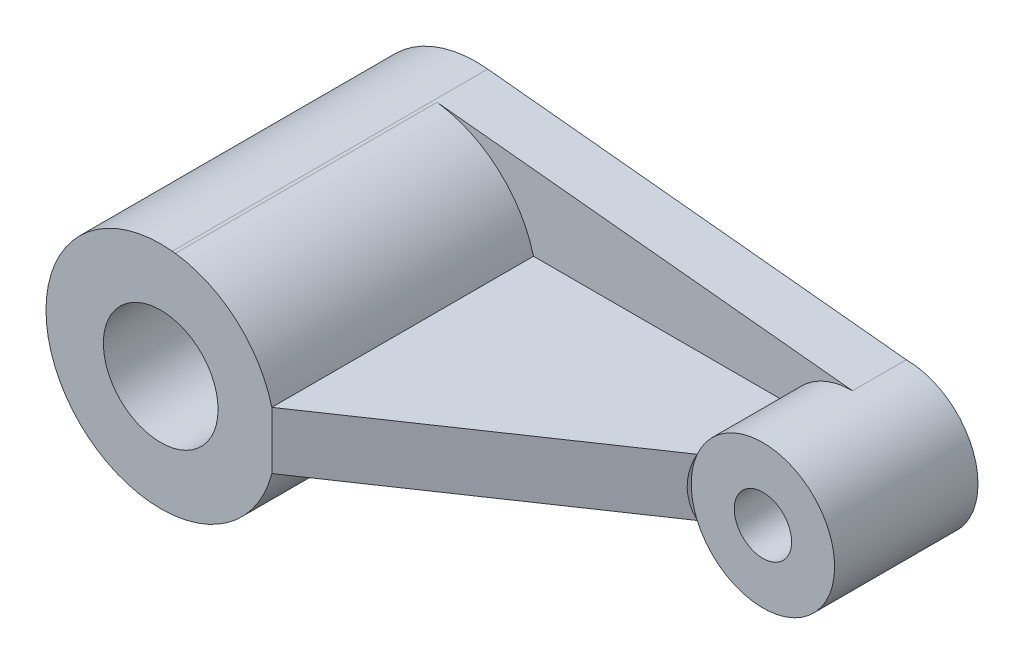
ISO-10303-21;
HEADER;
FILE_DESCRIPTION(('STEP AP214'),'2;1');
FILE_NAME('part.step','',(''),(''),'','','');
FILE_SCHEMA(('AUTOMOTIVE_DESIGN { 1 0 10303 214 1 1 1 1 }'));
ENDSEC;
DATA;
#1=APPLICATION_CONTEXT('core data for automotive mechanical design processes');
#2=APPLICATION_PROTOCOL_DEFINITION('international standard','automotive_design',2000,#1);
#3=PRODUCT_CONTEXT('',#1,'mechanical');
#4=PRODUCT('Part','Part','',(#3));
#5=PRODUCT_RELATED_PRODUCT_CATEGORY('part','',(#4));
#6=PRODUCT_DEFINITION_FORMATION('','',#4);
#7=PRODUCT_DEFINITION_CONTEXT('part definition',#1,'design');
#8=PRODUCT_DEFINITION('design','',#6,#7);
#9=PRODUCT_DEFINITION_SHAPE('','',#8);
#10=(LENGTH_UNIT() NAMED_UNIT(*) SI_UNIT(.MILLI.,.METRE.));
#11=(NAMED_UNIT(*) PLANE_ANGLE_UNIT() SI_UNIT($,.RADIAN.));
#12=(NAMED_UNIT(*) SI_UNIT($,.STERADIAN.) SOLID_ANGLE_UNIT());
#13=UNCERTAINTY_MEASURE_WITH_UNIT(LENGTH_MEASURE(1.E-05),#10,'distance_accuracy_value','');
#14=(GEOMETRIC_REPRESENTATION_CONTEXT(3) GLOBAL_UNCERTAINTY_ASSIGNED_CONTEXT((#13)) GLOBAL_UNIT_ASSIGNED_CONTEXT((#10,
#11,#12)) REPRESENTATION_CONTEXT('',''));
#15=CARTESIAN_POINT('',(0.,0.,0.));
#16=DIRECTION('',(0.,0.,1.));
#17=DIRECTION('',(1.,0.,0.));
#18=AXIS2_PLACEMENT_3D('',#15,#16,#17);
#19=CARTESIAN_POINT('',(0.,0.,15.));
#20=DIRECTION('',(0.,0.,1.));
#21=DIRECTION('',(1.,0.,0.));
#22=AXIS2_PLACEMENT_3D('',#19,#20,#21);
#23=PLANE('',#22);
#24=CARTESIAN_POINT('',(120.,0.,15.));
#25=DIRECTION('',(0.,0.,1.));
#26=DIRECTION('',(1.,0.,0.));
#27=AXIS2_PLACEMENT_3D('',#24,#25,#26);
#28=CIRCLE('',#27,20.);
#29=CARTESIAN_POINT('',(101.669697220177,-8.,15.));
#30=VERTEX_POINT('',#29);
#31=CARTESIAN_POINT('',(120.,-20.,15.));
#32=VERTEX_POINT('',#31);
#33=EDGE_CURVE('E65',#30,#32,#28,.T.);
#34=ORIENTED_EDGE('',*,*,#33,.F.);
#35=DIRECTION('',(1.,0.,0.));
#36=VECTOR('',#35,1.);
#37=CARTESIAN_POINT('',(0.,-8.,15.));
#38=LINE('',#37,#36);
#39=CARTESIAN_POINT('',(30.9960273962937,-8.,15.));
#40=VERTEX_POINT('',#39);
#41=EDGE_CURVE('E180',#40,#30,#38,.T.);
#42=ORIENTED_EDGE('',*,*,#41,.F.);
#43=CARTESIAN_POINT('',(0.,0.,15.));
#44=DIRECTION('',(0.,0.,1.));
#45=DIRECTION('',(1.,0.,0.));
#46=AXIS2_PLACEMENT_3D('',#43,#44,#45);
#47=CIRCLE('',#46,32.0117746204704);
#48=CARTESIAN_POINT('',(4.09093212595572,-31.7492990267913,15.));
#49=VERTEX_POINT('',#48);
#50=EDGE_CURVE('E56',#49,#40,#47,.T.);
#51=ORIENTED_EDGE('',*,*,#50,.F.);
#52=DIRECTION('',(0.994901670342997,0.1008497216095,0.));
#53=VECTOR('',#52,1.);
#54=CARTESIAN_POINT('',(3.22719109150401,-31.8368534509759,15.));
#55=LINE('',#54,#53);
#56=EDGE_CURVE('E111',#49,#32,#55,.T.);
#57=ORIENTED_EDGE('',*,*,#56,.T.);
#58=EDGE_LOOP('',(#34,#42,#51,#57));
#59=FACE_BOUND('',#58,.T.);
#60=ADVANCED_FACE('F41',(#59),#23,.T.);
#61=CARTESIAN_POINT('',(120.,0.,15.));
#62=DIRECTION('',(0.,0.,-1.));
#63=DIRECTION('',(-1.,0.,0.));
#64=AXIS2_PLACEMENT_3D('',#61,#62,#63);
#65=CYLINDRICAL_SURFACE('',#64,20.);
#66=DIRECTION('',(0.,0.,-1.));
#67=VECTOR('',#66,1.);
#68=CARTESIAN_POINT('',(101.669697220177,-8.,88.));
#69=LINE('',#68,#67);
#70=CARTESIAN_POINT('',(101.669697220177,-8.,40.));
#71=VERTEX_POINT('',#70);
#72=EDGE_CURVE('E169',#71,#30,#69,.T.);
#73=ORIENTED_EDGE('',*,*,#72,.T.);
#74=ORIENTED_EDGE('',*,*,#33,.T.);
#75=DIRECTION('',(0.,0.,-1.));
#76=VECTOR('',#75,1.);
#77=CARTESIAN_POINT('',(120.,-20.,15.));
#78=LINE('',#77,#76);
#79=CARTESIAN_POINT('',(120.,-20.,0.));
#80=VERTEX_POINT('',#79);
#81=EDGE_CURVE('E90',#32,#80,#78,.T.);
#82=ORIENTED_EDGE('',*,*,#81,.T.);
#83=CARTESIAN_POINT('',(120.,0.,0.));
#84=DIRECTION('',(0.,0.,1.));
#85=DIRECTION('',(1.,0.,0.));
#86=AXIS2_PLACEMENT_3D('',#83,#84,#85);
#87=CIRCLE('',#86,20.);
#88=CARTESIAN_POINT('',(120.,20.,0.));
#89=VERTEX_POINT('',#88);
#90=EDGE_CURVE('E82',#80,#89,#87,.T.);
#91=ORIENTED_EDGE('',*,*,#90,.T.);
#92=DIRECTION('',(0.,0.,-1.));
#93=VECTOR('',#92,1.);
#94=CARTESIAN_POINT('',(120.,20.,15.));
#95=LINE('',#94,#93);
#96=CARTESIAN_POINT('',(120.,20.,15.));
#97=VERTEX_POINT('',#96);
#98=EDGE_CURVE('E87',#97,#89,#95,.T.);
#99=ORIENTED_EDGE('',*,*,#98,.F.);
#100=CARTESIAN_POINT('',(101.669697220177,8.,15.));
#101=VERTEX_POINT('',#100);
#102=EDGE_CURVE('E157',#97,#101,#28,.T.);
#103=ORIENTED_EDGE('',*,*,#102,.T.);
#104=DIRECTION('',(0.,0.,-1.));
#105=VECTOR('',#104,1.);
#106=CARTESIAN_POINT('',(101.669697220177,8.,88.));
#107=LINE('',#106,#105);
#108=CARTESIAN_POINT('',(101.669697220177,8.,40.));
#109=VERTEX_POINT('',#108);
#110=EDGE_CURVE('E171',#109,#101,#107,.T.);
#111=ORIENTED_EDGE('',*,*,#110,.F.);
#112=CARTESIAN_POINT('',(120.,0.,40.));
#113=DIRECTION('',(0.,0.,1.));
#114=DIRECTION('',(1.,0.,0.));
#115=AXIS2_PLACEMENT_3D('',#112,#113,#114);
#116=CIRCLE('',#115,20.);
#117=EDGE_CURVE('E163',#71,#109,#116,.T.);
#118=ORIENTED_EDGE('',*,*,#117,.F.);
#119=EDGE_LOOP('',(#73,#74,#82,#91,#99,#103,#111,#118));
#120=FACE_BOUND('',#119,.T.);
#121=ADVANCED_FACE('F84',(#120),#65,.T.);
#122=CARTESIAN_POINT('',(0.,0.,88.));
#123=DIRECTION('',(0.,0.,-1.));
#124=DIRECTION('',(-1.,0.,0.));
#125=AXIS2_PLACEMENT_3D('',#122,#123,#124);
#126=CYLINDRICAL_SURFACE('',#125,32.0117746204704);
#127=DIRECTION('',(0.,0.,-1.));
#128=VECTOR('',#127,1.);
#129=CARTESIAN_POINT('',(30.9960273962937,-8.,88.));
#130=LINE('',#129,#128);
#131=CARTESIAN_POINT('',(30.9960273962937,-8.,88.));
#132=VERTEX_POINT('',#131);
#133=EDGE_CURVE('E166',#132,#40,#130,.T.);
#134=ORIENTED_EDGE('',*,*,#133,.F.);
#135=CARTESIAN_POINT('',(0.,0.,88.));
#136=DIRECTION('',(0.,0.,1.));
#137=DIRECTION('',(1.,0.,0.));
#138=AXIS2_PLACEMENT_3D('',#135,#136,#137);
#139=CIRCLE('',#138,32.0117746204704);
#140=CARTESIAN_POINT('',(4.09093212595597,-31.7492990267913,88.));
#141=VERTEX_POINT('',#140);
#142=EDGE_CURVE('E150',#141,#132,#139,.T.);
#143=ORIENTED_EDGE('',*,*,#142,.F.);
#144=DIRECTION('',(0.,0.,-1.));
#145=VECTOR('',#144,1.);
#146=CARTESIAN_POINT('',(4.09093212595597,-31.7492990267913,88.));
#147=LINE('',#146,#145);
#148=EDGE_CURVE('E137',#141,#49,#147,.T.);
#149=ORIENTED_EDGE('',*,*,#148,.T.);
#150=ORIENTED_EDGE('',*,*,#50,.T.);
#151=EDGE_LOOP('',(#134,#143,#149,#150));
#152=FACE_BOUND('',#151,.T.);
#153=ADVANCED_FACE('F234',(#152),#126,.T.);
#154=DIRECTION('',(1.,0.,0.));
#155=VECTOR('',#154,1.);
#156=CARTESIAN_POINT('',(0.,8.,15.));
#157=LINE('',#156,#155);
#158=CARTESIAN_POINT('',(30.9960273962937,8.,15.));
#159=VERTEX_POINT('',#158);
#160=EDGE_CURVE('E177',#159,#101,#157,.T.);
#161=ORIENTED_EDGE('',*,*,#160,.T.);
#162=ORIENTED_EDGE('',*,*,#102,.F.);
#163=DIRECTION('',(-0.994901670342997,0.1008497216095,0.));
#164=VECTOR('',#163,1.);
#165=CARTESIAN_POINT('',(3.22719109150401,31.8368534509759,15.));
#166=LINE('',#165,#164);
#167=CARTESIAN_POINT('',(4.09093212595621,31.7492990267913,15.));
#168=VERTEX_POINT('',#167);
#169=EDGE_CURVE('E103',#97,#168,#166,.T.);
#170=ORIENTED_EDGE('',*,*,#169,.T.);
#171=EDGE_CURVE('E145',#159,#168,#47,.T.);
#172=ORIENTED_EDGE('',*,*,#171,.F.);
#173=EDGE_LOOP('',(#161,#162,#170,#172));
#174=FACE_BOUND('',#173,.T.);
#175=ADVANCED_FACE('F240',(#174),#23,.T.);
#176=CARTESIAN_POINT('',(0.,0.,0.));
#177=DIRECTION('',(0.,0.,1.));
#178=DIRECTION('',(1.,0.,0.));
#179=AXIS2_PLACEMENT_3D('',#176,#177,#178);
#180=PLANE('',#179);
#181=CARTESIAN_POINT('',(0.,0.,0.));
#182=DIRECTION('',(0.,0.,1.));
#183=DIRECTION('',(1.,0.,0.));
#184=AXIS2_PLACEMENT_3D('',#181,#182,#183);
#185=CIRCLE('',#184,32.);
#186=CARTESIAN_POINT('',(3.22719109150401,31.8368534509759,0.));
#187=VERTEX_POINT('',#186);
#188=CARTESIAN_POINT('',(3.22719109150401,-31.8368534509759,0.));
#189=VERTEX_POINT('',#188);
#190=EDGE_CURVE('E110',#187,#189,#185,.T.);
#191=ORIENTED_EDGE('',*,*,#190,.F.);
#192=DIRECTION('',(-0.994901670342997,0.1008497216095,0.));
#193=VECTOR('',#192,1.);
#194=CARTESIAN_POINT('',(3.22719109150401,31.8368534509759,0.));
#195=LINE('',#194,#193);
#196=EDGE_CURVE('E93',#89,#187,#195,.T.);
#197=ORIENTED_EDGE('',*,*,#196,.F.);
#198=ORIENTED_EDGE('',*,*,#90,.F.);
#199=DIRECTION('',(0.994901670342997,0.1008497216095,0.));
#200=VECTOR('',#199,1.);
#201=CARTESIAN_POINT('',(3.22719109150401,-31.8368534509759,0.));
#202=LINE('',#201,#200);
#203=EDGE_CURVE('E94',#189,#80,#202,.T.);
#204=ORIENTED_EDGE('',*,*,#203,.F.);
#205=EDGE_LOOP('',(#191,#197,#198,#204));
#206=FACE_BOUND('',#205,.T.);
#207=CARTESIAN_POINT('',(0.,0.,0.));
#208=DIRECTION('',(0.,0.,1.));
#209=DIRECTION('',(1.,0.,0.));
#210=AXIS2_PLACEMENT_3D('',#207,#208,#209);
#211=CIRCLE('',#210,16.);
#212=CARTESIAN_POINT('',(16.,0.,0.));
#213=VERTEX_POINT('',#212);
#214=EDGE_CURVE('E128',#213,#213,#211,.T.);
#215=ORIENTED_EDGE('',*,*,#214,.T.);
#216=EDGE_LOOP('',(#215));
#217=FACE_BOUND('',#216,.T.);
#218=CARTESIAN_POINT('',(120.,0.,0.));
#219=DIRECTION('',(0.,0.,1.));
#220=DIRECTION('',(1.,0.,0.));
#221=AXIS2_PLACEMENT_3D('',#218,#219,#220);
#222=CIRCLE('',#221,8.);
#223=CARTESIAN_POINT('',(128.,0.,0.));
#224=VERTEX_POINT('',#223);
#225=EDGE_CURVE('E131',#224,#224,#222,.T.);
#226=ORIENTED_EDGE('',*,*,#225,.T.);
#227=EDGE_LOOP('',(#226));
#228=FACE_BOUND('',#227,.T.);
#229=ADVANCED_FACE('F107',(#206,#217,#228),#180,.F.);
#230=CARTESIAN_POINT('',(0.,0.,15.));
#231=DIRECTION('',(0.,0.,-1.));
#232=DIRECTION('',(-1.,0.,0.));
#233=AXIS2_PLACEMENT_3D('',#230,#231,#232);
#234=CYLINDRICAL_SURFACE('',#233,32.);
#235=ORIENTED_EDGE('',*,*,#190,.T.);
#236=DIRECTION('',(0.,0.,-1.));
#237=VECTOR('',#236,1.);
#238=CARTESIAN_POINT('',(3.22719109150401,-31.8368534509759,15.));
#239=LINE('',#238,#237);
#240=CARTESIAN_POINT('',(3.22719109150401,-31.8368534509759,88.));
#241=VERTEX_POINT('',#240);
#242=EDGE_CURVE('E49',#241,#189,#239,.T.);
#243=ORIENTED_EDGE('',*,*,#242,.F.);
#244=CARTESIAN_POINT('',(0.,0.,88.));
#245=DIRECTION('',(0.,0.,1.));
#246=DIRECTION('',(1.,0.,0.));
#247=AXIS2_PLACEMENT_3D('',#244,#245,#246);
#248=CIRCLE('',#247,32.);
#249=CARTESIAN_POINT('',(3.22719109150401,31.8368534509759,88.));
#250=VERTEX_POINT('',#249);
#251=EDGE_CURVE('E142',#250,#241,#248,.T.);
#252=ORIENTED_EDGE('',*,*,#251,.F.);
#253=DIRECTION('',(0.,0.,-1.));
#254=VECTOR('',#253,1.);
#255=CARTESIAN_POINT('',(3.22719109150401,31.8368534509759,15.));
#256=LINE('',#255,#254);
#257=EDGE_CURVE('E104',#250,#187,#256,.T.);
#258=ORIENTED_EDGE('',*,*,#257,.T.);
#259=EDGE_LOOP('',(#235,#243,#252,#258));
#260=FACE_BOUND('',#259,.T.);
#261=ADVANCED_FACE('F43',(#260),#234,.T.);
#262=CARTESIAN_POINT('',(3.22719109150401,-31.8368534509759,15.));
#263=DIRECTION('',(-0.1008497216095,0.994901670342997,0.));
#264=DIRECTION('',(-0.994901670342997,-0.1008497216095,0.));
#265=AXIS2_PLACEMENT_3D('',#262,#263,#264);
#266=PLANE('',#265);
#267=ORIENTED_EDGE('',*,*,#203,.T.);
#268=ORIENTED_EDGE('',*,*,#81,.F.);
#269=ORIENTED_EDGE('',*,*,#56,.F.);
#270=ORIENTED_EDGE('',*,*,#148,.F.);
#271=DIRECTION('',(0.994901670342997,0.1008497216095,0.));
#272=VECTOR('',#271,1.);
#273=CARTESIAN_POINT('',(3.22719109150401,-31.8368534509759,88.));
#274=LINE('',#273,#272);
#275=EDGE_CURVE('E124',#241,#141,#274,.T.);
#276=ORIENTED_EDGE('',*,*,#275,.F.);
#277=ORIENTED_EDGE('',*,*,#242,.T.);
#278=EDGE_LOOP('',(#267,#268,#269,#270,#276,#277));
#279=FACE_BOUND('',#278,.T.);
#280=ADVANCED_FACE('F121',(#279),#266,.F.);
#281=CARTESIAN_POINT('',(3.22719109150401,31.8368534509759,15.));
#282=DIRECTION('',(-0.1008497216095,-0.994901670342997,0.));
#283=DIRECTION('',(0.994901670342997,-0.1008497216095,0.));
#284=AXIS2_PLACEMENT_3D('',#281,#282,#283);
#285=PLANE('',#284);
#286=ORIENTED_EDGE('',*,*,#196,.T.);
#287=ORIENTED_EDGE('',*,*,#257,.F.);
#288=DIRECTION('',(-0.994901670342997,0.1008497216095,0.));
#289=VECTOR('',#288,1.);
#290=CARTESIAN_POINT('',(3.22719109150401,31.8368534509759,88.));
#291=LINE('',#290,#289);
#292=CARTESIAN_POINT('',(4.09093212595621,31.7492990267913,88.));
#293=VERTEX_POINT('',#292);
#294=EDGE_CURVE('E147',#293,#250,#291,.T.);
#295=ORIENTED_EDGE('',*,*,#294,.F.);
#296=DIRECTION('',(0.,0.,-1.));
#297=VECTOR('',#296,1.);
#298=CARTESIAN_POINT('',(4.09093212595621,31.7492990267913,88.));
#299=LINE('',#298,#297);
#300=EDGE_CURVE('E140',#293,#168,#299,.T.);
#301=ORIENTED_EDGE('',*,*,#300,.T.);
#302=ORIENTED_EDGE('',*,*,#169,.F.);
#303=ORIENTED_EDGE('',*,*,#98,.T.);
#304=EDGE_LOOP('',(#286,#287,#295,#301,#302,#303));
#305=FACE_BOUND('',#304,.T.);
#306=ADVANCED_FACE('F98',(#305),#285,.F.);
#307=CARTESIAN_POINT('',(0.,0.,15.));
#308=DIRECTION('',(0.,0.,-1.));
#309=DIRECTION('',(-1.,0.,0.));
#310=AXIS2_PLACEMENT_3D('',#307,#308,#309);
#311=CYLINDRICAL_SURFACE('',#310,16.);
#312=ORIENTED_EDGE('',*,*,#214,.F.);
#313=EDGE_LOOP('',(#312));
#314=FACE_BOUND('',#313,.T.);
#315=CARTESIAN_POINT('',(0.,0.,88.));
#316=DIRECTION('',(0.,0.,1.));
#317=DIRECTION('',(1.,0.,0.));
#318=AXIS2_PLACEMENT_3D('',#315,#316,#317);
#319=CIRCLE('',#318,16.);
#320=CARTESIAN_POINT('',(16.,0.,88.));
#321=VERTEX_POINT('',#320);
#322=EDGE_CURVE('E144',#321,#321,#319,.F.);
#323=ORIENTED_EDGE('',*,*,#322,.F.);
#324=EDGE_LOOP('',(#323));
#325=FACE_BOUND('',#324,.T.);
#326=ADVANCED_FACE('F224',(#314,#325),#311,.F.);
#327=CARTESIAN_POINT('',(120.,0.,15.));
#328=DIRECTION('',(0.,0.,-1.));
#329=DIRECTION('',(-1.,0.,0.));
#330=AXIS2_PLACEMENT_3D('',#327,#328,#329);
#331=CYLINDRICAL_SURFACE('',#330,8.);
#332=ORIENTED_EDGE('',*,*,#225,.F.);
#333=EDGE_LOOP('',(#332));
#334=FACE_BOUND('',#333,.T.);
#335=CARTESIAN_POINT('',(120.,0.,40.));
#336=DIRECTION('',(0.,0.,1.));
#337=DIRECTION('',(1.,0.,0.));
#338=AXIS2_PLACEMENT_3D('',#335,#336,#337);
#339=CIRCLE('',#338,8.);
#340=CARTESIAN_POINT('',(128.,0.,40.));
#341=VERTEX_POINT('',#340);
#342=EDGE_CURVE('E159',#341,#341,#339,.F.);
#343=ORIENTED_EDGE('',*,*,#342,.F.);
#344=EDGE_LOOP('',(#343));
#345=FACE_BOUND('',#344,.T.);
#346=ADVANCED_FACE('F221',(#334,#345),#331,.F.);
#347=CARTESIAN_POINT('',(30.9960273962937,8.,88.));
#348=VERTEX_POINT('',#347);
#349=EDGE_CURVE('E153',#348,#293,#139,.T.);
#350=ORIENTED_EDGE('',*,*,#349,.F.);
#351=DIRECTION('',(0.,0.,-1.));
#352=VECTOR('',#351,1.);
#353=CARTESIAN_POINT('',(30.9960273962937,8.,88.));
#354=LINE('',#353,#352);
#355=EDGE_CURVE('E174',#348,#159,#354,.T.);
#356=ORIENTED_EDGE('',*,*,#355,.T.);
#357=ORIENTED_EDGE('',*,*,#171,.T.);
#358=ORIENTED_EDGE('',*,*,#300,.F.);
#359=EDGE_LOOP('',(#350,#356,#357,#358));
#360=FACE_BOUND('',#359,.T.);
#361=ADVANCED_FACE('F223',(#360),#126,.T.);
#362=CARTESIAN_POINT('',(0.,0.,88.));
#363=DIRECTION('',(0.,0.,1.));
#364=DIRECTION('',(1.,0.,0.));
#365=AXIS2_PLACEMENT_3D('',#362,#363,#364);
#366=PLANE('',#365);
#367=DIRECTION('',(0.,-1.,0.));
#368=VECTOR('',#367,1.);
#369=CARTESIAN_POINT('',(30.9960273962937,65.,88.));
#370=LINE('',#369,#368);
#371=EDGE_CURVE('E186',#348,#132,#370,.T.);
#372=ORIENTED_EDGE('',*,*,#371,.F.);
#373=ORIENTED_EDGE('',*,*,#349,.T.);
#374=ORIENTED_EDGE('',*,*,#294,.T.);
#375=ORIENTED_EDGE('',*,*,#251,.T.);
#376=ORIENTED_EDGE('',*,*,#275,.T.);
#377=ORIENTED_EDGE('',*,*,#142,.T.);
#378=EDGE_LOOP('',(#372,#373,#374,#375,#376,#377));
#379=FACE_BOUND('',#378,.T.);
#380=ORIENTED_EDGE('',*,*,#322,.T.);
#381=EDGE_LOOP('',(#380));
#382=FACE_BOUND('',#381,.T.);
#383=ADVANCED_FACE('F217',(#379,#382),#366,.T.);
#384=CARTESIAN_POINT('',(0.,0.,40.));
#385=DIRECTION('',(0.,0.,1.));
#386=DIRECTION('',(1.,0.,0.));
#387=AXIS2_PLACEMENT_3D('',#384,#385,#386);
#388=PLANE('',#387);
#389=EDGE_CURVE('E160',#109,#71,#116,.T.);
#390=ORIENTED_EDGE('',*,*,#389,.T.);
#391=ORIENTED_EDGE('',*,*,#117,.T.);
#392=EDGE_LOOP('',(#390,#391));
#393=FACE_BOUND('',#392,.T.);
#394=ORIENTED_EDGE('',*,*,#342,.T.);
#395=EDGE_LOOP('',(#394));
#396=FACE_BOUND('',#395,.T.);
#397=ADVANCED_FACE('F214',(#393,#396),#388,.T.);
#398=CARTESIAN_POINT('',(0.,-8.,88.));
#399=DIRECTION('',(0.,1.,0.));
#400=DIRECTION('',(0.,0.,1.));
#401=AXIS2_PLACEMENT_3D('',#398,#399,#400);
#402=PLANE('',#401);
#403=ORIENTED_EDGE('',*,*,#72,.F.);
#404=DIRECTION('',(0.827242570199512,0.,-0.56184493416752));
#405=VECTOR('',#404,1.);
#406=CARTESIAN_POINT('',(30.9960273962937,-8.,88.));
#407=LINE('',#406,#405);
#408=EDGE_CURVE('E189',#132,#71,#407,.T.);
#409=ORIENTED_EDGE('',*,*,#408,.F.);
#410=ORIENTED_EDGE('',*,*,#133,.T.);
#411=ORIENTED_EDGE('',*,*,#41,.T.);
#412=EDGE_LOOP('',(#403,#409,#410,#411));
#413=FACE_BOUND('',#412,.T.);
#414=ADVANCED_FACE('F210',(#413),#402,.F.);
#415=CARTESIAN_POINT('',(120.,0.,88.));
#416=DIRECTION('',(0.,0.,-1.));
#417=DIRECTION('',(-1.,0.,0.));
#418=AXIS2_PLACEMENT_3D('',#415,#416,#417);
#419=CYLINDRICAL_SURFACE('',#418,20.);
#420=ORIENTED_EDGE('',*,*,#389,.F.);
#421=CARTESIAN_POINT('',(120.,0.,27.550462065659));
#422=DIRECTION('',(-0.56184493416752,0.,-0.827242570199512));
#423=DIRECTION('',(0.827242570199512,0.,-0.56184493416752));
#424=AXIS2_PLACEMENT_3D('',#421,#422,#423);
#425=ELLIPSE('',#424,24.1767055038965,20.);
#426=EDGE_CURVE('E183',#109,#71,#425,.F.);
#427=ORIENTED_EDGE('',*,*,#426,.T.);
#428=EDGE_LOOP('',(#420,#427));
#429=FACE_BOUND('',#428,.T.);
#430=ADVANCED_FACE('F207',(#429),#419,.F.);
#431=CARTESIAN_POINT('',(0.,8.,88.));
#432=DIRECTION('',(0.,1.,0.));
#433=DIRECTION('',(0.,0.,1.));
#434=AXIS2_PLACEMENT_3D('',#431,#432,#433);
#435=PLANE('',#434);
#436=DIRECTION('',(-0.827242570199512,0.,0.56184493416752));
#437=VECTOR('',#436,1.);
#438=CARTESIAN_POINT('',(9.78450760080131,8.,102.40639707434));
#439=LINE('',#438,#437);
#440=EDGE_CURVE('E11',#109,#348,#439,.T.);
#441=ORIENTED_EDGE('',*,*,#440,.F.);
#442=ORIENTED_EDGE('',*,*,#110,.T.);
#443=ORIENTED_EDGE('',*,*,#160,.F.);
#444=ORIENTED_EDGE('',*,*,#355,.F.);
#445=EDGE_LOOP('',(#441,#442,#443,#444));
#446=FACE_BOUND('',#445,.T.);
#447=ADVANCED_FACE('F261',(#446),#435,.T.);
#448=CARTESIAN_POINT('',(30.9960273962937,65.,88.));
#449=DIRECTION('',(-0.56184493416752,0.,-0.827242570199512));
#450=DIRECTION('',(-0.827242570199512,0.,0.56184493416752));
#451=AXIS2_PLACEMENT_3D('',#448,#449,#450);
#452=PLANE('',#451);
#453=ORIENTED_EDGE('',*,*,#440,.T.);
#454=ORIENTED_EDGE('',*,*,#371,.T.);
#455=ORIENTED_EDGE('',*,*,#408,.T.);
#456=ORIENTED_EDGE('',*,*,#426,.F.);
#457=EDGE_LOOP('',(#453,#454,#455,#456));
#458=FACE_BOUND('',#457,.T.);
#459=ADVANCED_FACE('F195',(#458),#452,.F.);
#460=CLOSED_SHELL('',(#60,#121,#153,#175,#229,#261,#280,#306,#326,#346,#361,#383,#397,#414,#430,
#447,#459));
#461=MANIFOLD_SOLID_BREP('B2',#460);
#462=ADVANCED_BREP_SHAPE_REPRESENTATION('',(#18,#461),#14);
#463=SHAPE_DEFINITION_REPRESENTATION(#9,#462);
ENDSEC;
END-ISO-10303-21;
